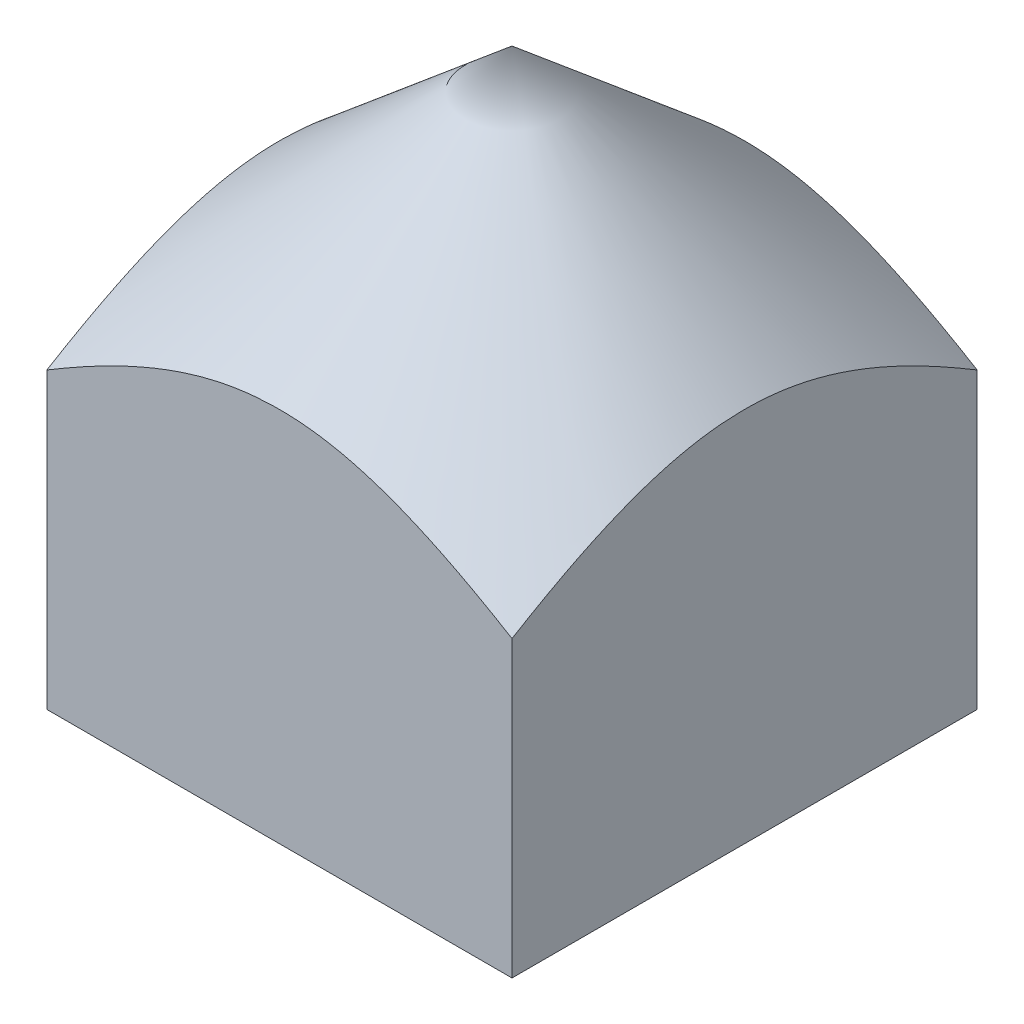
ISO-10303-21;
HEADER;
FILE_DESCRIPTION(('STEP AP214'),'2;1');
FILE_NAME('part.step','',(''),(''),'','','');
FILE_SCHEMA(('AUTOMOTIVE_DESIGN { 1 0 10303 214 1 1 1 1 }'));
ENDSEC;
DATA;
#1=APPLICATION_CONTEXT('core data for automotive mechanical design processes');
#2=APPLICATION_PROTOCOL_DEFINITION('international standard','automotive_design',2000,#1);
#3=PRODUCT_CONTEXT('',#1,'mechanical');
#4=PRODUCT('Part','Part','',(#3));
#5=PRODUCT_RELATED_PRODUCT_CATEGORY('part','',(#4));
#6=PRODUCT_DEFINITION_FORMATION('','',#4);
#7=PRODUCT_DEFINITION_CONTEXT('part definition',#1,'design');
#8=PRODUCT_DEFINITION('design','',#6,#7);
#9=PRODUCT_DEFINITION_SHAPE('','',#8);
#10=(LENGTH_UNIT() NAMED_UNIT(*) SI_UNIT(.MILLI.,.METRE.));
#11=(NAMED_UNIT(*) PLANE_ANGLE_UNIT() SI_UNIT($,.RADIAN.));
#12=(NAMED_UNIT(*) SI_UNIT($,.STERADIAN.) SOLID_ANGLE_UNIT());
#13=UNCERTAINTY_MEASURE_WITH_UNIT(LENGTH_MEASURE(1.E-05),#10,'distance_accuracy_value','');
#14=(GEOMETRIC_REPRESENTATION_CONTEXT(3) GLOBAL_UNCERTAINTY_ASSIGNED_CONTEXT((#13)) GLOBAL_UNIT_ASSIGNED_CONTEXT((#10,
#11,#12)) REPRESENTATION_CONTEXT('',''));
#15=CARTESIAN_POINT('',(0.,0.,0.));
#16=DIRECTION('',(0.,0.,1.));
#17=DIRECTION('',(1.,0.,0.));
#18=AXIS2_PLACEMENT_3D('',#15,#16,#17);
#19=CARTESIAN_POINT('',(-30.,80.,-30.));
#20=DIRECTION('',(1.,0.,0.));
#21=DIRECTION('',(0.,0.,-1.));
#22=AXIS2_PLACEMENT_3D('',#19,#20,#21);
#23=PLANE('',#22);
#24=CARTESIAN_POINT('',(-30.,-20.8765279597616,-107.229151132052));
#25=CARTESIAN_POINT('',(-30.,-19.9852520103845,-106.14425956612));
#26=CARTESIAN_POINT('',(-30.,-19.094558690057,-105.058889349194));
#27=CARTESIAN_POINT('',(-30.,-17.3144550256509,-102.887097003419));
#28=CARTESIAN_POINT('',(-30.,-16.4250446818284,-101.800674874361));
#29=CARTESIAN_POINT('',(-30.,-13.7589017954723,-98.5396729270807));
#30=CARTESIAN_POINT('',(-30.,-11.9842708707791,-96.3633739410305));
#31=CARTESIAN_POINT('',(-30.,-8.44129443081294,-92.0046442604088));
#32=CARTESIAN_POINT('',(-30.,-6.67295082706765,-89.8222120111663));
#33=CARTESIAN_POINT('',(-30.,-4.02670533960702,-86.543510670682));
#34=CARTESIAN_POINT('',(-30.,-3.14567017590401,-85.4497701594944));
#35=CARTESIAN_POINT('',(-30.,-1.38593417151468,-83.2604084693045));
#36=CARTESIAN_POINT('',(-30.,-0.507233336597738,-82.1647872856648));
#37=CARTESIAN_POINT('',(-30.,2.11746418376214,-78.8841712356425));
#38=CARTESIAN_POINT('',(-30.,3.85960060182126,-76.6960847834133));
#39=CARTESIAN_POINT('',(-30.,7.33082106888948,-72.3095824939959));
#40=CARTESIAN_POINT('',(-30.,9.05990516985917,-70.1111666979849));
#41=CARTESIAN_POINT('',(-30.,11.6407373000736,-66.8037654500193));
#42=CARTESIAN_POINT('',(-30.,12.4988333409875,-65.6997325720461));
#43=CARTESIAN_POINT('',(-30.,14.2101554330616,-63.4878955180591));
#44=CARTESIAN_POINT('',(-30.,15.0633814808091,-62.3800913394034));
#45=CARTESIAN_POINT('',(-30.,16.7642038174308,-60.1601932640217));
#46=CARTESIAN_POINT('',(-30.,17.6118001875275,-59.0480994295526));
#47=CARTESIAN_POINT('',(-30.,19.3004609948171,-56.8189662690145));
#48=CARTESIAN_POINT('',(-30.,20.1415254559069,-55.7019269610621));
#49=CARTESIAN_POINT('',(-30.,21.6866135775642,-53.6351994574951));
#50=CARTESIAN_POINT('',(-30.,22.3917283136149,-52.6863272071378));
#51=CARTESIAN_POINT('',(-30.,23.7956640031369,-50.7839347545557));
#52=CARTESIAN_POINT('',(-30.,24.4944849564577,-49.8304145522198));
#53=CARTESIAN_POINT('',(-30.,25.884895820337,-47.9179970060227));
#54=CARTESIAN_POINT('',(-30.,26.5764851533709,-46.9590992419581));
#55=CARTESIAN_POINT('',(-30.,27.9511674560688,-45.0352276178528));
#56=CARTESIAN_POINT('',(-30.,28.6342604292202,-44.0702537603063));
#57=CARTESIAN_POINT('',(-30.,29.9932527026787,-42.1293317131855));
#58=CARTESIAN_POINT('',(-30.,30.6691109192539,-41.1533547245651));
#59=CARTESIAN_POINT('',(-30.,32.0089088636578,-39.1932335038235));
#60=CARTESIAN_POINT('',(-30.,32.672848521501,-38.2090892237936));
#61=CARTESIAN_POINT('',(-30.,33.9863861560747,-36.231449044055));
#62=CARTESIAN_POINT('',(-30.,34.6359860274778,-35.2379544048235));
#63=CARTESIAN_POINT('',(-30.,35.9179911400485,-33.2399210557396));
#64=CARTESIAN_POINT('',(-30.,36.5503966244001,-32.2353825023663));
#65=CARTESIAN_POINT('',(-30.,37.6801746397263,-30.3988187117099));
#66=CARTESIAN_POINT('',(-30.,38.1810399591092,-29.5689446545425));
#67=CARTESIAN_POINT('',(-30.,39.1662161089205,-27.8993973870333));
#68=CARTESIAN_POINT('',(-30.,39.6505268637024,-27.0597241319374));
#69=CARTESIAN_POINT('',(-30.,40.5996949392769,-25.368796185026));
#70=CARTESIAN_POINT('',(-30.,41.0645410965648,-24.5175352083293));
#71=CARTESIAN_POINT('',(-30.,41.9705667583792,-22.8024753554216));
#72=CARTESIAN_POINT('',(-30.,42.4117465320165,-21.9386766219195));
#73=CARTESIAN_POINT('',(-30.,43.2637306419821,-20.2008958113478));
#74=CARTESIAN_POINT('',(-30.,43.6746605705368,-19.3269755877759));
#75=CARTESIAN_POINT('',(-30.,44.4624909565746,-17.5637608125893));
#76=CARTESIAN_POINT('',(-30.,44.8393890313293,-16.6744651896569));
#77=CARTESIAN_POINT('',(-30.,45.5517520336388,-14.8804335442692));
#78=CARTESIAN_POINT('',(-30.,45.8872608378807,-13.9757150504085));
#79=CARTESIAN_POINT('',(-30.,46.5092036180199,-12.1494616225227));
#80=CARTESIAN_POINT('',(-30.,46.7956436340059,-11.2279287737237));
#81=CARTESIAN_POINT('',(-30.,47.2033388855981,-9.75601233243632));
#82=CARTESIAN_POINT('',(-30.,47.3437070785568,-9.21088984153851));
#83=CARTESIAN_POINT('',(-30.,47.6029319081103,-8.11561496934092));
#84=CARTESIAN_POINT('',(-30.,47.7217921563313,-7.56546344884816));
#85=CARTESIAN_POINT('',(-30.,47.9363279064182,-6.4606790785766));
#86=CARTESIAN_POINT('',(-30.,48.0320049313708,-5.90604652566701));
#87=CARTESIAN_POINT('',(-30.,48.1986820876147,-4.79306362223456));
#88=CARTESIAN_POINT('',(-30.,48.2696821005465,-4.23471325389285));
#89=CARTESIAN_POINT('',(-30.,48.3855479395279,-3.11768680076491));
#90=CARTESIAN_POINT('',(-30.,48.4305232737871,-2.55902212999365));
#91=CARTESIAN_POINT('',(-30.,48.493999890865,-1.44018588964091));
#92=CARTESIAN_POINT('',(-30.,48.5125013361439,-0.880014329327778));
#93=CARTESIAN_POINT('',(-30.,48.5226888128588,0.240594380587761));
#94=CARTESIAN_POINT('',(-30.,48.514373859556,0.801031539187727));
#95=CARTESIAN_POINT('',(-30.,48.4710807881061,1.92087103366484));
#96=CARTESIAN_POINT('',(-30.,48.4361026033429,2.48027336695305));
#97=CARTESIAN_POINT('',(-30.,48.3403040776113,3.59467638878237));
#98=CARTESIAN_POINT('',(-30.,48.2795838613341,4.14968573231522));
#99=CARTESIAN_POINT('',(-30.,48.1333606474811,5.25641530058795));
#100=CARTESIAN_POINT('',(-30.,48.047857588226,5.80813551713838));
#101=CARTESIAN_POINT('',(-30.,47.8534296161305,6.90745936563585));
#102=CARTESIAN_POINT('',(-30.,47.7445028381784,7.45506266617818));
#103=CARTESIAN_POINT('',(-30.,47.5048204416943,8.54545276515691));
#104=CARTESIAN_POINT('',(-30.,47.3740647252323,9.08823954197373));
#105=CARTESIAN_POINT('',(-30.,47.0916079223155,10.1717129238979));
#106=CARTESIAN_POINT('',(-30.,46.9397886044298,10.712368590911));
#107=CARTESIAN_POINT('',(-30.,46.6175622289377,11.7880966367541));
#108=CARTESIAN_POINT('',(-30.,46.4471550066669,12.323168966077));
#109=CARTESIAN_POINT('',(-30.,46.0895297076952,13.3875092474469));
#110=CARTESIAN_POINT('',(-30.,45.90231563819,13.9167785494966));
#111=CARTESIAN_POINT('',(-30.,45.5126948635505,14.9696415823588));
#112=CARTESIAN_POINT('',(-30.,45.310288852748,15.4932355713054));
#113=CARTESIAN_POINT('',(-30.,44.6507106522047,17.1351440557246));
#114=CARTESIAN_POINT('',(-30.,44.1687229258047,18.2435357656224));
#115=CARTESIAN_POINT('',(-30.,43.1546835745841,20.437313233853));
#116=CARTESIAN_POINT('',(-30.,42.6226153226425,21.5226912038611));
#117=CARTESIAN_POINT('',(-30.,41.5182245624048,23.6743516996459));
#118=CARTESIAN_POINT('',(-30.,40.9458535059568,24.7406091851402));
#119=CARTESIAN_POINT('',(-30.,39.7695885599978,26.8553489909948));
#120=CARTESIAN_POINT('',(-30.,39.1656980433599,27.9038331974177));
#121=CARTESIAN_POINT('',(-30.,37.9298643823582,29.9902281843788));
#122=CARTESIAN_POINT('',(-30.,37.2978109769103,31.0280734245674));
#123=CARTESIAN_POINT('',(-30.,36.0129316451706,33.0908171665597));
#124=CARTESIAN_POINT('',(-30.,35.3601052796273,34.1157153939533));
#125=CARTESIAN_POINT('',(-30.,34.037864922014,36.1537997283816));
#126=CARTESIAN_POINT('',(-30.,33.3684618046468,37.1669929061363));
#127=CARTESIAN_POINT('',(-30.,32.0155989238591,39.1839212667269));
#128=CARTESIAN_POINT('',(-30.,31.3321392834976,40.1876565322507));
#129=CARTESIAN_POINT('',(-30.,29.9453677834449,42.1987604939995));
#130=CARTESIAN_POINT('',(-30.,29.2419170143494,43.20603327338));
#131=CARTESIAN_POINT('',(-30.,27.8248920645947,45.2134264955253));
#132=CARTESIAN_POINT('',(-30.,27.11131786947,46.2135469280671));
#133=CARTESIAN_POINT('',(-30.,25.6754863325193,48.207723887978));
#134=CARTESIAN_POINT('',(-30.,24.9532278909467,49.2017796227849));
#135=CARTESIAN_POINT('',(-30.,23.5013611123808,51.1845035321829));
#136=CARTESIAN_POINT('',(-30.,22.7717527822816,52.173171711826));
#137=CARTESIAN_POINT('',(-30.,21.3080417245397,54.1433250604747));
#138=CARTESIAN_POINT('',(-30.,20.5739548683271,55.1248220284642));
#139=CARTESIAN_POINT('',(-30.,19.1003113766271,57.0837034686532));
#140=CARTESIAN_POINT('',(-30.,18.3607547250196,58.0610879287195));
#141=CARTESIAN_POINT('',(-30.,16.8769031366159,60.0121809442727));
#142=CARTESIAN_POINT('',(-30.,16.1326084194326,60.9858896668482));
#143=CARTESIAN_POINT('',(-30.,14.6398257743702,62.9300883753438));
#144=CARTESIAN_POINT('',(-30.,13.8913378397475,63.9005783560836));
#145=CARTESIAN_POINT('',(-30.,11.7392244760215,66.6800515118437));
#146=CARTESIAN_POINT('',(-30.,10.3310043297188,68.4854778770695));
#147=CARTESIAN_POINT('',(-30.,7.50424597146266,72.0882507209079));
#148=CARTESIAN_POINT('',(-30.,6.08570766777886,73.8855971274575));
#149=CARTESIAN_POINT('',(-30.,3.23913530410589,77.4750075669438));
#150=CARTESIAN_POINT('',(-30.,1.81109477043582,79.2670664635025));
#151=CARTESIAN_POINT('',(-30.,-1.05191842953143,82.8456269397611));
#152=CARTESIAN_POINT('',(-30.,-2.48689107608278,84.6321285352671));
#153=CARTESIAN_POINT('',(-30.,-5.32897372560791,88.1587117856995));
#154=CARTESIAN_POINT('',(-30.,-6.73594987771562,89.8989013528407));
#155=CARTESIAN_POINT('',(-30.,-9.55457582946394,93.3754939480612));
#156=CARTESIAN_POINT('',(-30.,-10.9662256349896,95.1118969713681));
#157=CARTESIAN_POINT('',(-30.,-13.7923599879186,98.5800494115014));
#158=CARTESIAN_POINT('',(-30.,-15.2068413052122,100.311801461288));
#159=CARTESIAN_POINT('',(-30.,-18.0392401263112,103.772484509563));
#160=CARTESIAN_POINT('',(-30.,-19.4571576194069,105.501415516816));
#161=CARTESIAN_POINT('',(-30.,-20.8765279597616,107.229151132052));
#162=B_SPLINE_CURVE_WITH_KNOTS('',3,(#24,#25,#26,#27,#28,#29,#30,#31,#32,#33,#34,#35,#36,#37,
#38,#39,#40,#41,#42,#43,#44,#45,#46,#47,#48,#49,#50,#51,#52,#53,#54,#55,#56,#57,#58,#59,#60,#61,
#62,#63,#64,#65,#66,#67,#68,#69,#70,#71,#72,#73,#74,#75,#76,#77,#78,#79,#80,#81,#82,#83,#84,#85,
#86,#87,#88,#89,#90,#91,#92,#93,#94,#95,#96,#97,#98,#99,#100,#101,#102,#103,#104,#105,#106,#107,
#108,#109,#110,#111,#112,#113,#114,#115,#116,#117,#118,#119,#120,#121,#122,#123,#124,#125,#126,
#127,#128,#129,#130,#131,#132,#133,#134,#135,#136,#137,#138,#139,#140,#141,#142,#143,#144,#145,
#146,#147,#148,#149,#150,#151,#152,#153,#154,#155,#156,#157,#158,#159,#160,#161),.UNSPECIFIED.,
.F.,.F.,(4,2,2,2,2,2,2,2,2,2,2,2,2,2,2,2,2,2,2,2,2,2,2,2,2,2,2,2,2,2,2,2,2,2,2,2,2,2,2,2,2,2,2,
2,2,2,2,2,2,2,2,2,2,2,2,2,2,2,2,2,2,2,2,2,2,2,2,2,4),(0.,4.21215624368648,8.424313328212,
16.8486911523316,25.2754422419295,29.4888016696343,33.7021715011416,42.0928938457363,
50.4835827696677,54.6784445924741,58.8733093546611,63.0681134631373,67.2629022176937,
70.8094148730608,74.3559276132387,77.9027214509698,81.4495138328575,85.0108776776628,
88.572262427897,92.1331737720494,95.6940347272134,98.601799157831,101.50957687379,
104.419000058899,107.328390153906,110.224926034885,113.121664558819,116.0153053743,
118.90858974272,120.596935091957,122.284996669661,123.972947315343,125.660906056918,
127.341709462109,129.022502552805,130.703357365481,132.384216377661,134.058596749013,
135.732981287587,137.407499198284,139.082024621467,140.766361181804,142.450712664373,
144.134663614342,145.818537647915,149.442722100081,153.06811408252,156.697950439291,
160.327399163267,163.972581768464,167.617841503599,171.260770108605,174.903666834839,
178.589373339664,182.275085111588,185.961268652471,189.647448736107,193.32437927048,
197.001320645457,200.678092814547,204.354870898226,211.223867513584,218.092925270503,
224.967275020593,231.841605200934,238.55505801928,245.268519294333,251.976532464618,
258.684524754356),.UNSPECIFIED.);
#163=CARTESIAN_POINT('',(-30.,37.9182801171622,-30.));
#164=VERTEX_POINT('',#163);
#165=CARTESIAN_POINT('',(-30.,37.9182801171622,30.));
#166=VERTEX_POINT('',#165);
#167=EDGE_CURVE('E96',#164,#166,#162,.T.);
#168=ORIENTED_EDGE('',*,*,#167,.F.);
#169=DIRECTION('',(0.,-1.,0.));
#170=VECTOR('',#169,1.);
#171=CARTESIAN_POINT('',(-30.,80.,-30.));
#172=LINE('',#171,#170);
#173=CARTESIAN_POINT('',(-30.,0.,-30.));
#174=VERTEX_POINT('',#173);
#175=EDGE_CURVE('E72',#164,#174,#172,.T.);
#176=ORIENTED_EDGE('',*,*,#175,.T.);
#177=DIRECTION('',(0.,0.,1.));
#178=VECTOR('',#177,1.);
#179=CARTESIAN_POINT('',(-30.,0.,-30.));
#180=LINE('',#179,#178);
#181=CARTESIAN_POINT('',(-30.,0.,30.));
#182=VERTEX_POINT('',#181);
#183=EDGE_CURVE('E101',#174,#182,#180,.T.);
#184=ORIENTED_EDGE('',*,*,#183,.T.);
#185=DIRECTION('',(0.,-1.,0.));
#186=VECTOR('',#185,1.);
#187=CARTESIAN_POINT('',(-30.,80.,30.));
#188=LINE('',#187,#186);
#189=EDGE_CURVE('E58',#166,#182,#188,.T.);
#190=ORIENTED_EDGE('',*,*,#189,.F.);
#191=EDGE_LOOP('',(#168,#176,#184,#190));
#192=FACE_BOUND('',#191,.T.);
#193=ADVANCED_FACE('F43',(#192),#23,.F.);
#194=CARTESIAN_POINT('',(30.,80.,30.));
#195=DIRECTION('',(0.,0.,-1.));
#196=DIRECTION('',(-1.,0.,0.));
#197=AXIS2_PLACEMENT_3D('',#194,#195,#196);
#198=PLANE('',#197);
#199=CARTESIAN_POINT('',(-107.229151132052,-20.8765279597616,30.));
#200=CARTESIAN_POINT('',(-106.14425956612,-19.9852520103845,30.));
#201=CARTESIAN_POINT('',(-105.058889349194,-19.094558690057,30.));
#202=CARTESIAN_POINT('',(-102.887097003419,-17.3144550256509,30.));
#203=CARTESIAN_POINT('',(-101.80067487436,-16.4250446818284,30.));
#204=CARTESIAN_POINT('',(-98.5396729270807,-13.7589017954722,30.));
#205=CARTESIAN_POINT('',(-96.3633739410305,-11.9842708707791,30.));
#206=CARTESIAN_POINT('',(-92.0046442604088,-8.44129443081293,30.));
#207=CARTESIAN_POINT('',(-89.8222120111663,-6.67295082706765,30.));
#208=CARTESIAN_POINT('',(-86.543510670682,-4.02670533960702,30.));
#209=CARTESIAN_POINT('',(-85.4497701594944,-3.14567017590401,30.));
#210=CARTESIAN_POINT('',(-83.2604084693045,-1.38593417151468,30.));
#211=CARTESIAN_POINT('',(-82.1647872856648,-0.507233336597739,30.));
#212=CARTESIAN_POINT('',(-78.8841712356425,2.11746418376214,30.));
#213=CARTESIAN_POINT('',(-76.6960847834133,3.85960060182127,30.));
#214=CARTESIAN_POINT('',(-72.3095824939959,7.33082106888948,30.));
#215=CARTESIAN_POINT('',(-70.1111666979849,9.05990516985917,30.));
#216=CARTESIAN_POINT('',(-66.8037654500193,11.6407373000736,30.));
#217=CARTESIAN_POINT('',(-65.6997325720461,12.4988333409875,30.));
#218=CARTESIAN_POINT('',(-63.4878955180591,14.2101554330617,30.));
#219=CARTESIAN_POINT('',(-62.3800913394033,15.0633814808091,30.));
#220=CARTESIAN_POINT('',(-60.1601932640216,16.7642038174308,30.));
#221=CARTESIAN_POINT('',(-59.0480994295525,17.6118001875275,30.));
#222=CARTESIAN_POINT('',(-56.8189662690145,19.3004609948171,30.));
#223=CARTESIAN_POINT('',(-55.7019269610621,20.1415254559069,30.));
#224=CARTESIAN_POINT('',(-53.6351994574951,21.6866135775642,30.));
#225=CARTESIAN_POINT('',(-52.6863272071378,22.3917283136149,30.));
#226=CARTESIAN_POINT('',(-50.7839347545557,23.7956640031369,30.));
#227=CARTESIAN_POINT('',(-49.8304145522198,24.4944849564577,30.));
#228=CARTESIAN_POINT('',(-47.9179970060227,25.884895820337,30.));
#229=CARTESIAN_POINT('',(-46.9590992419581,26.5764851533709,30.));
#230=CARTESIAN_POINT('',(-45.0352276178528,27.9511674560688,30.));
#231=CARTESIAN_POINT('',(-44.0702537603063,28.6342604292202,30.));
#232=CARTESIAN_POINT('',(-42.1293317131855,29.9932527026787,30.));
#233=CARTESIAN_POINT('',(-41.1533547245651,30.6691109192538,30.));
#234=CARTESIAN_POINT('',(-39.1932335038235,32.0089088636577,30.));
#235=CARTESIAN_POINT('',(-38.2090892237936,32.672848521501,30.));
#236=CARTESIAN_POINT('',(-36.231449044055,33.9863861560747,30.));
#237=CARTESIAN_POINT('',(-35.2379544048235,34.6359860274778,30.));
#238=CARTESIAN_POINT('',(-33.2399210557396,35.9179911400485,30.));
#239=CARTESIAN_POINT('',(-32.2353825023663,36.5503966244001,30.));
#240=CARTESIAN_POINT('',(-30.3988187117099,37.6801746397263,30.));
#241=CARTESIAN_POINT('',(-29.5689446545425,38.1810399591092,30.));
#242=CARTESIAN_POINT('',(-27.8993973870334,39.1662161089205,30.));
#243=CARTESIAN_POINT('',(-27.0597241319374,39.6505268637024,30.));
#244=CARTESIAN_POINT('',(-25.368796185026,40.5996949392769,30.));
#245=CARTESIAN_POINT('',(-24.5175352083294,41.0645410965648,30.));
#246=CARTESIAN_POINT('',(-22.8024753554216,41.9705667583792,30.));
#247=CARTESIAN_POINT('',(-21.9386766219195,42.4117465320165,30.));
#248=CARTESIAN_POINT('',(-20.2008958113478,43.2637306419821,30.));
#249=CARTESIAN_POINT('',(-19.3269755877759,43.6746605705368,30.));
#250=CARTESIAN_POINT('',(-17.5637608125893,44.4624909565746,30.));
#251=CARTESIAN_POINT('',(-16.674465189657,44.8393890313293,30.));
#252=CARTESIAN_POINT('',(-14.8804335442692,45.5517520336388,30.));
#253=CARTESIAN_POINT('',(-13.9757150504085,45.8872608378807,30.));
#254=CARTESIAN_POINT('',(-12.1494616225228,46.5092036180199,30.));
#255=CARTESIAN_POINT('',(-11.2279287737238,46.7956436340059,30.));
#256=CARTESIAN_POINT('',(-9.75601233243632,47.2033388855981,30.));
#257=CARTESIAN_POINT('',(-9.21088984153852,47.3437070785568,30.));
#258=CARTESIAN_POINT('',(-8.11561496934092,47.6029319081103,30.));
#259=CARTESIAN_POINT('',(-7.56546344884816,47.7217921563313,30.));
#260=CARTESIAN_POINT('',(-6.46067907857659,47.9363279064182,30.));
#261=CARTESIAN_POINT('',(-5.90604652566699,48.0320049313708,30.));
#262=CARTESIAN_POINT('',(-4.79306362223454,48.1986820876147,30.));
#263=CARTESIAN_POINT('',(-4.23471325389283,48.2696821005465,30.));
#264=CARTESIAN_POINT('',(-3.1176868007649,48.3855479395279,30.));
#265=CARTESIAN_POINT('',(-2.55902212999365,48.4305232737871,30.));
#266=CARTESIAN_POINT('',(-1.44018588964093,48.493999890865,30.));
#267=CARTESIAN_POINT('',(-0.880014329327796,48.5125013361439,30.));
#268=CARTESIAN_POINT('',(0.240594380587744,48.5226888128588,30.));
#269=CARTESIAN_POINT('',(0.801031539187712,48.514373859556,30.));
#270=CARTESIAN_POINT('',(1.92087103366483,48.4710807881061,30.));
#271=CARTESIAN_POINT('',(2.48027336695304,48.4361026033429,30.));
#272=CARTESIAN_POINT('',(3.59467638878235,48.3403040776113,30.));
#273=CARTESIAN_POINT('',(4.1496857323152,48.2795838613341,30.));
#274=CARTESIAN_POINT('',(5.25641530058792,48.1333606474811,30.));
#275=CARTESIAN_POINT('',(5.80813551713835,48.047857588226,30.));
#276=CARTESIAN_POINT('',(6.90745936563582,47.8534296161305,30.));
#277=CARTESIAN_POINT('',(7.45506266617815,47.7445028381785,30.));
#278=CARTESIAN_POINT('',(8.54545276515689,47.5048204416943,30.));
#279=CARTESIAN_POINT('',(9.08823954197371,47.3740647252323,30.));
#280=CARTESIAN_POINT('',(10.1717129238979,47.0916079223155,30.));
#281=CARTESIAN_POINT('',(10.712368590911,46.9397886044298,30.));
#282=CARTESIAN_POINT('',(11.7880966367541,46.6175622289377,30.));
#283=CARTESIAN_POINT('',(12.3231689660771,46.4471550066668,30.));
#284=CARTESIAN_POINT('',(13.3875092474469,46.0895297076952,30.));
#285=CARTESIAN_POINT('',(13.9167785494966,45.90231563819,30.));
#286=CARTESIAN_POINT('',(14.9696415823588,45.5126948635505,30.));
#287=CARTESIAN_POINT('',(15.4932355713054,45.310288852748,30.));
#288=CARTESIAN_POINT('',(17.1351440557246,44.6507106522047,30.));
#289=CARTESIAN_POINT('',(18.2435357656223,44.1687229258047,30.));
#290=CARTESIAN_POINT('',(20.437313233853,43.1546835745841,30.));
#291=CARTESIAN_POINT('',(21.5226912038611,42.6226153226425,30.));
#292=CARTESIAN_POINT('',(23.6743516996459,41.5182245624048,30.));
#293=CARTESIAN_POINT('',(24.7406091851402,40.9458535059568,30.));
#294=CARTESIAN_POINT('',(26.8553489909948,39.7695885599978,30.));
#295=CARTESIAN_POINT('',(27.9038331974177,39.1656980433599,30.));
#296=CARTESIAN_POINT('',(29.9902281843788,37.9298643823582,30.));
#297=CARTESIAN_POINT('',(31.0280734245674,37.2978109769103,30.));
#298=CARTESIAN_POINT('',(33.0908171665597,36.0129316451706,30.));
#299=CARTESIAN_POINT('',(34.1157153939532,35.3601052796273,30.));
#300=CARTESIAN_POINT('',(36.1537997283816,34.037864922014,30.));
#301=CARTESIAN_POINT('',(37.1669929061363,33.3684618046468,30.));
#302=CARTESIAN_POINT('',(39.1839212667268,32.0155989238591,30.));
#303=CARTESIAN_POINT('',(40.1876565322507,31.3321392834976,30.));
#304=CARTESIAN_POINT('',(42.1987604939995,29.9453677834449,30.));
#305=CARTESIAN_POINT('',(43.2060332733799,29.2419170143494,30.));
#306=CARTESIAN_POINT('',(45.2134264955253,27.8248920645947,30.));
#307=CARTESIAN_POINT('',(46.2135469280671,27.11131786947,30.));
#308=CARTESIAN_POINT('',(48.207723887978,25.6754863325193,30.));
#309=CARTESIAN_POINT('',(49.2017796227849,24.9532278909466,30.));
#310=CARTESIAN_POINT('',(51.1845035321829,23.5013611123808,30.));
#311=CARTESIAN_POINT('',(52.173171711826,22.7717527822816,30.));
#312=CARTESIAN_POINT('',(54.1433250604746,21.3080417245397,30.));
#313=CARTESIAN_POINT('',(55.1248220284641,20.5739548683271,30.));
#314=CARTESIAN_POINT('',(57.0837034686532,19.1003113766271,30.));
#315=CARTESIAN_POINT('',(58.0610879287194,18.3607547250197,30.));
#316=CARTESIAN_POINT('',(60.0121809442727,16.8769031366159,30.));
#317=CARTESIAN_POINT('',(60.9858896668482,16.1326084194327,30.));
#318=CARTESIAN_POINT('',(62.9300883753437,14.6398257743702,30.));
#319=CARTESIAN_POINT('',(63.9005783560835,13.8913378397476,30.));
#320=CARTESIAN_POINT('',(66.6800515118436,11.7392244760215,30.));
#321=CARTESIAN_POINT('',(68.4854778770695,10.3310043297188,30.));
#322=CARTESIAN_POINT('',(72.0882507209078,7.50424597146269,30.));
#323=CARTESIAN_POINT('',(73.8855971274575,6.08570766777889,30.));
#324=CARTESIAN_POINT('',(77.4750075669438,3.2391353041059,30.));
#325=CARTESIAN_POINT('',(79.2670664635025,1.81109477043582,30.));
#326=CARTESIAN_POINT('',(82.8456269397611,-1.05191842953143,30.));
#327=CARTESIAN_POINT('',(84.6321285352671,-2.48689107608279,30.));
#328=CARTESIAN_POINT('',(88.1587117856995,-5.32897372560791,30.));
#329=CARTESIAN_POINT('',(89.8989013528407,-6.73594987771561,30.));
#330=CARTESIAN_POINT('',(93.3754939480612,-9.55457582946394,30.));
#331=CARTESIAN_POINT('',(95.1118969713681,-10.9662256349896,30.));
#332=CARTESIAN_POINT('',(98.5800494115014,-13.7923599879186,30.));
#333=CARTESIAN_POINT('',(100.311801461288,-15.2068413052121,30.));
#334=CARTESIAN_POINT('',(103.772484509563,-18.0392401263112,30.));
#335=CARTESIAN_POINT('',(105.501415516816,-19.4571576194069,30.));
#336=CARTESIAN_POINT('',(107.229151132052,-20.8765279597616,30.));
#337=B_SPLINE_CURVE_WITH_KNOTS('',3,(#199,#200,#201,#202,#203,#204,#205,#206,#207,#208,#209,
#210,#211,#212,#213,#214,#215,#216,#217,#218,#219,#220,#221,#222,#223,#224,#225,#226,#227,#228,
#229,#230,#231,#232,#233,#234,#235,#236,#237,#238,#239,#240,#241,#242,#243,#244,#245,#246,#247,
#248,#249,#250,#251,#252,#253,#254,#255,#256,#257,#258,#259,#260,#261,#262,#263,#264,#265,#266,
#267,#268,#269,#270,#271,#272,#273,#274,#275,#276,#277,#278,#279,#280,#281,#282,#283,#284,#285,
#286,#287,#288,#289,#290,#291,#292,#293,#294,#295,#296,#297,#298,#299,#300,#301,#302,#303,#304,
#305,#306,#307,#308,#309,#310,#311,#312,#313,#314,#315,#316,#317,#318,#319,#320,#321,#322,#323,
#324,#325,#326,#327,#328,#329,#330,#331,#332,#333,#334,#335,#336),.UNSPECIFIED.,.F.,.F.,(4,2,2,
2,2,2,2,2,2,2,2,2,2,2,2,2,2,2,2,2,2,2,2,2,2,2,2,2,2,2,2,2,2,2,2,2,2,2,2,2,2,2,2,2,2,2,2,2,2,2,2,
2,2,2,2,2,2,2,2,2,2,2,2,2,2,2,2,2,4),(0.,4.21215624368648,8.42431332821199,16.8486911523316,
25.2754422419295,29.4888016696343,33.7021715011415,42.0928938457363,50.4835827696677,
54.6784445924741,58.873309354661,63.0681134631373,67.2629022176937,70.8094148730608,
74.3559276132386,77.9027214509698,81.4495138328574,85.0108776776628,88.5722624278969,
92.1331737720494,95.6940347272134,98.6017991578309,101.50957687379,104.419000058899,
107.328390153906,110.224926034885,113.121664558819,116.0153053743,118.90858974272,
120.596935091957,122.284996669661,123.972947315343,125.660906056918,127.341709462109,
129.022502552805,130.703357365481,132.384216377661,134.058596749013,135.732981287587,
137.407499198284,139.082024621467,140.766361181804,142.450712664373,144.134663614342,
145.818537647915,149.442722100081,153.06811408252,156.697950439291,160.327399163267,
163.972581768464,167.617841503599,171.260770108605,174.903666834839,178.589373339664,
182.275085111588,185.961268652471,189.647448736107,193.32437927048,197.001320645457,
200.678092814547,204.354870898226,211.223867513584,218.092925270503,224.967275020593,
231.841605200934,238.55505801928,245.268519294333,251.976532464618,258.684524754356),.UNSPECIFIED.);
#338=CARTESIAN_POINT('',(30.,37.9182801171622,30.));
#339=VERTEX_POINT('',#338);
#340=EDGE_CURVE('E98',#166,#339,#337,.T.);
#341=ORIENTED_EDGE('',*,*,#340,.F.);
#342=ORIENTED_EDGE('',*,*,#189,.T.);
#343=DIRECTION('',(1.,0.,0.));
#344=VECTOR('',#343,1.);
#345=CARTESIAN_POINT('',(30.,0.,30.));
#346=LINE('',#345,#344);
#347=CARTESIAN_POINT('',(30.,0.,30.));
#348=VERTEX_POINT('',#347);
#349=EDGE_CURVE('E128',#182,#348,#346,.T.);
#350=ORIENTED_EDGE('',*,*,#349,.T.);
#351=DIRECTION('',(0.,-1.,0.));
#352=VECTOR('',#351,1.);
#353=CARTESIAN_POINT('',(30.,80.,30.));
#354=LINE('',#353,#352);
#355=EDGE_CURVE('E108',#339,#348,#354,.T.);
#356=ORIENTED_EDGE('',*,*,#355,.F.);
#357=EDGE_LOOP('',(#341,#342,#350,#356));
#358=FACE_BOUND('',#357,.T.);
#359=ADVANCED_FACE('F105',(#358),#198,.F.);
#360=CARTESIAN_POINT('',(30.,80.,-30.));
#361=DIRECTION('',(-1.,0.,0.));
#362=DIRECTION('',(0.,0.,1.));
#363=AXIS2_PLACEMENT_3D('',#360,#361,#362);
#364=PLANE('',#363);
#365=CARTESIAN_POINT('',(30.,-20.8765279597616,107.229151132052));
#366=CARTESIAN_POINT('',(30.,-19.9852520103845,106.14425956612));
#367=CARTESIAN_POINT('',(30.,-19.094558690057,105.058889349194));
#368=CARTESIAN_POINT('',(30.,-17.3144550256509,102.887097003419));
#369=CARTESIAN_POINT('',(30.,-16.4250446818284,101.800674874361));
#370=CARTESIAN_POINT('',(30.,-13.7589017954722,98.5396729270807));
#371=CARTESIAN_POINT('',(30.,-11.9842708707791,96.3633739410305));
#372=CARTESIAN_POINT('',(30.,-8.44129443081295,92.0046442604088));
#373=CARTESIAN_POINT('',(30.,-6.67295082706767,89.8222120111663));
#374=CARTESIAN_POINT('',(30.,-4.02670533960703,86.543510670682));
#375=CARTESIAN_POINT('',(30.,-3.14567017590402,85.4497701594945));
#376=CARTESIAN_POINT('',(30.,-1.38593417151469,83.2604084693045));
#377=CARTESIAN_POINT('',(30.,-0.507233336597753,82.1647872856649));
#378=CARTESIAN_POINT('',(30.,2.11746418376212,78.8841712356425));
#379=CARTESIAN_POINT('',(30.,3.85960060182124,76.6960847834134));
#380=CARTESIAN_POINT('',(30.,7.33082106888944,72.309582493996));
#381=CARTESIAN_POINT('',(30.,9.05990516985912,70.1111666979849));
#382=CARTESIAN_POINT('',(30.,11.6407373000736,66.8037654500194));
#383=CARTESIAN_POINT('',(30.,12.4988333409874,65.6997325720462));
#384=CARTESIAN_POINT('',(30.,14.2101554330616,63.4878955180592));
#385=CARTESIAN_POINT('',(30.,15.0633814808091,62.3800913394034));
#386=CARTESIAN_POINT('',(30.,16.7642038174307,60.1601932640217));
#387=CARTESIAN_POINT('',(30.,17.6118001875275,59.0480994295526));
#388=CARTESIAN_POINT('',(30.,19.300460994817,56.8189662690146));
#389=CARTESIAN_POINT('',(30.,20.1415254559068,55.7019269610622));
#390=CARTESIAN_POINT('',(30.,21.6866135775642,53.6351994574952));
#391=CARTESIAN_POINT('',(30.,22.3917283136149,52.6863272071378));
#392=CARTESIAN_POINT('',(30.,23.7956640031369,50.7839347545557));
#393=CARTESIAN_POINT('',(30.,24.4944849564577,49.8304145522199));
#394=CARTESIAN_POINT('',(30.,25.8848958203369,47.9179970060228));
#395=CARTESIAN_POINT('',(30.,26.5764851533708,46.9590992419581));
#396=CARTESIAN_POINT('',(30.,27.9511674560688,45.0352276178528));
#397=CARTESIAN_POINT('',(30.,28.6342604292202,44.0702537603064));
#398=CARTESIAN_POINT('',(30.,29.9932527026787,42.1293317131856));
#399=CARTESIAN_POINT('',(30.,30.6691109192538,41.1533547245652));
#400=CARTESIAN_POINT('',(30.,32.0089088636577,39.1932335038235));
#401=CARTESIAN_POINT('',(30.,32.672848521501,38.2090892237936));
#402=CARTESIAN_POINT('',(30.,33.9863861560747,36.231449044055));
#403=CARTESIAN_POINT('',(30.,34.6359860274778,35.2379544048235));
#404=CARTESIAN_POINT('',(30.,35.9179911400485,33.2399210557397));
#405=CARTESIAN_POINT('',(30.,36.5503966244001,32.2353825023663));
#406=CARTESIAN_POINT('',(30.,37.6801746397263,30.3988187117099));
#407=CARTESIAN_POINT('',(30.,38.1810399591092,29.5689446545425));
#408=CARTESIAN_POINT('',(30.,39.1662161089205,27.8993973870334));
#409=CARTESIAN_POINT('',(30.,39.6505268637024,27.0597241319374));
#410=CARTESIAN_POINT('',(30.,40.5996949392769,25.368796185026));
#411=CARTESIAN_POINT('',(30.,41.0645410965648,24.5175352083294));
#412=CARTESIAN_POINT('',(30.,41.9705667583792,22.8024753554217));
#413=CARTESIAN_POINT('',(30.,42.4117465320165,21.9386766219196));
#414=CARTESIAN_POINT('',(30.,43.2637306419821,20.2008958113478));
#415=CARTESIAN_POINT('',(30.,43.6746605705368,19.3269755877759));
#416=CARTESIAN_POINT('',(30.,44.4624909565746,17.5637608125893));
#417=CARTESIAN_POINT('',(30.,44.8393890313293,16.674465189657));
#418=CARTESIAN_POINT('',(30.,45.5517520336388,14.8804335442692));
#419=CARTESIAN_POINT('',(30.,45.8872608378807,13.9757150504085));
#420=CARTESIAN_POINT('',(30.,46.5092036180199,12.1494616225228));
#421=CARTESIAN_POINT('',(30.,46.7956436340059,11.2279287737238));
#422=CARTESIAN_POINT('',(30.,47.2033388855981,9.75601233243638));
#423=CARTESIAN_POINT('',(30.,47.3437070785568,9.21088984153858));
#424=CARTESIAN_POINT('',(30.,47.6029319081103,8.11561496934099));
#425=CARTESIAN_POINT('',(30.,47.7217921563313,7.56546344884823));
#426=CARTESIAN_POINT('',(30.,47.9363279064181,6.46067907857667));
#427=CARTESIAN_POINT('',(30.,48.0320049313707,5.90604652566708));
#428=CARTESIAN_POINT('',(30.,48.1986820876147,4.79306362223463));
#429=CARTESIAN_POINT('',(30.,48.2696821005465,4.23471325389291));
#430=CARTESIAN_POINT('',(30.,48.3855479395279,3.11768680076498));
#431=CARTESIAN_POINT('',(30.,48.4305232737871,2.55902212999372));
#432=CARTESIAN_POINT('',(30.,48.493999890865,1.440185889641));
#433=CARTESIAN_POINT('',(30.,48.5125013361439,0.880014329327872));
#434=CARTESIAN_POINT('',(30.,48.5226888128588,-0.240594380587654));
#435=CARTESIAN_POINT('',(30.,48.514373859556,-0.801031539187619));
#436=CARTESIAN_POINT('',(30.,48.4710807881061,-1.92087103366474));
#437=CARTESIAN_POINT('',(30.,48.4361026033429,-2.48027336695296));
#438=CARTESIAN_POINT('',(30.,48.3403040776113,-3.59467638878228));
#439=CARTESIAN_POINT('',(30.,48.2795838613341,-4.14968573231512));
#440=CARTESIAN_POINT('',(30.,48.1333606474811,-5.25641530058785));
#441=CARTESIAN_POINT('',(30.,48.047857588226,-5.80813551713828));
#442=CARTESIAN_POINT('',(30.,47.8534296161305,-6.90745936563576));
#443=CARTESIAN_POINT('',(30.,47.7445028381785,-7.45506266617809));
#444=CARTESIAN_POINT('',(30.,47.5048204416943,-8.54545276515682));
#445=CARTESIAN_POINT('',(30.,47.3740647252324,-9.08823954197365));
#446=CARTESIAN_POINT('',(30.,47.0916079223155,-10.1717129238978));
#447=CARTESIAN_POINT('',(30.,46.9397886044298,-10.7123685909109));
#448=CARTESIAN_POINT('',(30.,46.6175622289377,-11.788096636754));
#449=CARTESIAN_POINT('',(30.,46.4471550066669,-12.323168966077));
#450=CARTESIAN_POINT('',(30.,46.0895297076952,-13.3875092474468));
#451=CARTESIAN_POINT('',(30.,45.90231563819,-13.9167785494965));
#452=CARTESIAN_POINT('',(30.,45.5126948635505,-14.9696415823587));
#453=CARTESIAN_POINT('',(30.,45.310288852748,-15.4932355713053));
#454=CARTESIAN_POINT('',(30.,44.6507106522047,-17.1351440557245));
#455=CARTESIAN_POINT('',(30.,44.1687229258048,-18.2435357656222));
#456=CARTESIAN_POINT('',(30.,43.1546835745842,-20.4373132338529));
#457=CARTESIAN_POINT('',(30.,42.6226153226425,-21.522691203861));
#458=CARTESIAN_POINT('',(30.,41.5182245624049,-23.6743516996457));
#459=CARTESIAN_POINT('',(30.,40.9458535059569,-24.74060918514));
#460=CARTESIAN_POINT('',(30.,39.7695885599979,-26.8553489909946));
#461=CARTESIAN_POINT('',(30.,39.16569804336,-27.9038331974175));
#462=CARTESIAN_POINT('',(30.,37.9298643823583,-29.9902281843786));
#463=CARTESIAN_POINT('',(30.,37.2978109769105,-31.0280734245671));
#464=CARTESIAN_POINT('',(30.,36.0129316451707,-33.0908171665594));
#465=CARTESIAN_POINT('',(30.,35.3601052796274,-34.115715393953));
#466=CARTESIAN_POINT('',(30.,34.0378649220141,-36.1537997283814));
#467=CARTESIAN_POINT('',(30.,33.368461804647,-37.166992906136));
#468=CARTESIAN_POINT('',(30.,32.0155989238593,-39.1839212667265));
#469=CARTESIAN_POINT('',(30.,31.3321392834979,-40.1876565322504));
#470=CARTESIAN_POINT('',(30.,29.9453677834452,-42.1987604939992));
#471=CARTESIAN_POINT('',(30.,29.2419170143497,-43.2060332733796));
#472=CARTESIAN_POINT('',(30.,27.824892064595,-45.2134264955249));
#473=CARTESIAN_POINT('',(30.,27.1113178694703,-46.2135469280667));
#474=CARTESIAN_POINT('',(30.,25.6754863325196,-48.2077238879775));
#475=CARTESIAN_POINT('',(30.,24.953227890947,-49.2017796227845));
#476=CARTESIAN_POINT('',(30.,23.5013611123811,-51.1845035321824));
#477=CARTESIAN_POINT('',(30.,22.7717527822819,-52.1731717118255));
#478=CARTESIAN_POINT('',(30.,21.3080417245401,-54.1433250604742));
#479=CARTESIAN_POINT('',(30.,20.5739548683275,-55.1248220284636));
#480=CARTESIAN_POINT('',(30.,19.1003113766275,-57.0837034686527));
#481=CARTESIAN_POINT('',(30.,18.3607547250201,-58.0610879287189));
#482=CARTESIAN_POINT('',(30.,16.8769031366163,-60.0121809442722));
#483=CARTESIAN_POINT('',(30.,16.1326084194331,-60.9858896668476));
#484=CARTESIAN_POINT('',(30.,14.6398257743706,-62.9300883753431));
#485=CARTESIAN_POINT('',(30.,13.891337839748,-63.900578356083));
#486=CARTESIAN_POINT('',(30.,11.739224476022,-66.6800515118431));
#487=CARTESIAN_POINT('',(30.,10.3310043297192,-68.485477877069));
#488=CARTESIAN_POINT('',(30.,7.50424597146306,-72.0882507209074));
#489=CARTESIAN_POINT('',(30.,6.08570766777925,-73.885597127457));
#490=CARTESIAN_POINT('',(30.,3.23913530410623,-77.4750075669434));
#491=CARTESIAN_POINT('',(30.,1.81109477043614,-79.267066463502));
#492=CARTESIAN_POINT('',(30.,-1.05191842953115,-82.8456269397608));
#493=CARTESIAN_POINT('',(30.,-2.48689107608253,-84.6321285352668));
#494=CARTESIAN_POINT('',(30.,-5.3289737256077,-88.1587117856992));
#495=CARTESIAN_POINT('',(30.,-6.73594987771543,-89.8989013528404));
#496=CARTESIAN_POINT('',(30.,-9.55457582946378,-93.375493948061));
#497=CARTESIAN_POINT('',(30.,-10.9662256349894,-95.1118969713679));
#498=CARTESIAN_POINT('',(30.,-13.7923599879185,-98.5800494115013));
#499=CARTESIAN_POINT('',(30.,-15.2068413052121,-100.311801461288));
#500=CARTESIAN_POINT('',(30.,-18.0392401263112,-103.772484509563));
#501=CARTESIAN_POINT('',(30.,-19.4571576194069,-105.501415516816));
#502=CARTESIAN_POINT('',(30.,-20.8765279597616,-107.229151132052));
#503=B_SPLINE_CURVE_WITH_KNOTS('',3,(#365,#366,#367,#368,#369,#370,#371,#372,#373,#374,#375,
#376,#377,#378,#379,#380,#381,#382,#383,#384,#385,#386,#387,#388,#389,#390,#391,#392,#393,#394,
#395,#396,#397,#398,#399,#400,#401,#402,#403,#404,#405,#406,#407,#408,#409,#410,#411,#412,#413,
#414,#415,#416,#417,#418,#419,#420,#421,#422,#423,#424,#425,#426,#427,#428,#429,#430,#431,#432,
#433,#434,#435,#436,#437,#438,#439,#440,#441,#442,#443,#444,#445,#446,#447,#448,#449,#450,#451,
#452,#453,#454,#455,#456,#457,#458,#459,#460,#461,#462,#463,#464,#465,#466,#467,#468,#469,#470,
#471,#472,#473,#474,#475,#476,#477,#478,#479,#480,#481,#482,#483,#484,#485,#486,#487,#488,#489,
#490,#491,#492,#493,#494,#495,#496,#497,#498,#499,#500,#501,#502),.UNSPECIFIED.,.F.,.F.,(4,2,2,
2,2,2,2,2,2,2,2,2,2,2,2,2,2,2,2,2,2,2,2,2,2,2,2,2,2,2,2,2,2,2,2,2,2,2,2,2,2,2,2,2,2,2,2,2,2,2,2,
2,2,2,2,2,2,2,2,2,2,2,2,2,2,2,2,2,4),(0.,4.21215624368646,8.42431332821198,16.8486911523316,
25.2754422419294,29.4888016696343,33.7021715011415,42.0928938457363,50.4835827696676,
54.678444592474,58.873309354661,63.0681134631372,67.2629022176936,70.8094148730607,
74.3559276132386,77.9027214509698,81.4495138328574,85.0108776776628,88.5722624278969,
92.1331737720494,95.6940347272134,98.601799157831,101.50957687379,104.419000058899,
107.328390153906,110.224926034885,113.121664558819,116.0153053743,118.90858974272,
120.596935091957,122.284996669661,123.972947315343,125.660906056918,127.341709462109,
129.022502552805,130.703357365481,132.384216377661,134.058596749013,135.732981287587,
137.407499198284,139.082024621467,140.766361181803,142.450712664373,144.134663614342,
145.818537647914,149.442722100081,153.06811408252,156.697950439291,160.327399163267,
163.972581768463,167.617841503598,171.260770108605,174.903666834839,178.589373339664,
182.275085111587,185.96126865247,189.647448736106,193.324379270479,197.001320645457,
200.678092814546,204.354870898225,211.223867513583,218.092925270502,224.967275020592,
231.841605200934,238.55505801928,245.268519294333,251.976532464618,258.684524754356),.UNSPECIFIED.);
#504=CARTESIAN_POINT('',(30.,37.9182801171622,-30.));
#505=VERTEX_POINT('',#504);
#506=EDGE_CURVE('E64',#339,#505,#503,.T.);
#507=ORIENTED_EDGE('',*,*,#506,.F.);
#508=ORIENTED_EDGE('',*,*,#355,.T.);
#509=DIRECTION('',(0.,0.,-1.));
#510=VECTOR('',#509,1.);
#511=CARTESIAN_POINT('',(30.,0.,-30.));
#512=LINE('',#511,#510);
#513=CARTESIAN_POINT('',(30.,0.,-30.));
#514=VERTEX_POINT('',#513);
#515=EDGE_CURVE('E124',#348,#514,#512,.T.);
#516=ORIENTED_EDGE('',*,*,#515,.T.);
#517=DIRECTION('',(0.,-1.,0.));
#518=VECTOR('',#517,1.);
#519=CARTESIAN_POINT('',(30.,80.,-30.));
#520=LINE('',#519,#518);
#521=EDGE_CURVE('E114',#505,#514,#520,.T.);
#522=ORIENTED_EDGE('',*,*,#521,.F.);
#523=EDGE_LOOP('',(#507,#508,#516,#522));
#524=FACE_BOUND('',#523,.T.);
#525=ADVANCED_FACE('F152',(#524),#364,.F.);
#526=CARTESIAN_POINT('',(30.,80.,-30.));
#527=DIRECTION('',(0.,0.,1.));
#528=DIRECTION('',(1.,0.,0.));
#529=AXIS2_PLACEMENT_3D('',#526,#527,#528);
#530=PLANE('',#529);
#531=CARTESIAN_POINT('',(107.229151132052,-20.8765279597616,-30.));
#532=CARTESIAN_POINT('',(106.14425956612,-19.9852520103845,-30.));
#533=CARTESIAN_POINT('',(105.058889349194,-19.094558690057,-30.));
#534=CARTESIAN_POINT('',(102.887097003419,-17.3144550256509,-30.));
#535=CARTESIAN_POINT('',(101.800674874361,-16.4250446818284,-30.));
#536=CARTESIAN_POINT('',(98.5396729270807,-13.7589017954722,-30.));
#537=CARTESIAN_POINT('',(96.3633739410305,-11.9842708707791,-30.));
#538=CARTESIAN_POINT('',(92.0046442604088,-8.44129443081296,-30.));
#539=CARTESIAN_POINT('',(89.8222120111663,-6.67295082706768,-30.));
#540=CARTESIAN_POINT('',(86.543510670682,-4.02670533960703,-30.));
#541=CARTESIAN_POINT('',(85.4497701594945,-3.14567017590402,-30.));
#542=CARTESIAN_POINT('',(83.2604084693045,-1.38593417151468,-30.));
#543=CARTESIAN_POINT('',(82.1647872856649,-0.507233336597747,-30.));
#544=CARTESIAN_POINT('',(78.8841712356425,2.11746418376212,-30.));
#545=CARTESIAN_POINT('',(76.6960847834134,3.85960060182125,-30.));
#546=CARTESIAN_POINT('',(72.309582493996,7.33082106888945,-30.));
#547=CARTESIAN_POINT('',(70.1111666979849,9.05990516985913,-30.));
#548=CARTESIAN_POINT('',(66.8037654500194,11.6407373000736,-30.));
#549=CARTESIAN_POINT('',(65.6997325720461,12.4988333409875,-30.));
#550=CARTESIAN_POINT('',(63.4878955180592,14.2101554330616,-30.));
#551=CARTESIAN_POINT('',(62.3800913394034,15.0633814808091,-30.));
#552=CARTESIAN_POINT('',(60.1601932640217,16.7642038174308,-30.));
#553=CARTESIAN_POINT('',(59.0480994295526,17.6118001875275,-30.));
#554=CARTESIAN_POINT('',(56.8189662690146,19.3004609948171,-30.));
#555=CARTESIAN_POINT('',(55.7019269610622,20.1415254559069,-30.));
#556=CARTESIAN_POINT('',(53.6351994574952,21.6866135775642,-30.));
#557=CARTESIAN_POINT('',(52.6863272071378,22.3917283136149,-30.));
#558=CARTESIAN_POINT('',(50.7839347545557,23.7956640031369,-30.));
#559=CARTESIAN_POINT('',(49.8304145522198,24.4944849564577,-30.));
#560=CARTESIAN_POINT('',(47.9179970060228,25.884895820337,-30.));
#561=CARTESIAN_POINT('',(46.9590992419581,26.5764851533709,-30.));
#562=CARTESIAN_POINT('',(45.0352276178528,27.9511674560688,-30.));
#563=CARTESIAN_POINT('',(44.0702537603064,28.6342604292202,-30.));
#564=CARTESIAN_POINT('',(42.1293317131856,29.9932527026787,-30.));
#565=CARTESIAN_POINT('',(41.1533547245652,30.6691109192538,-30.));
#566=CARTESIAN_POINT('',(39.1932335038235,32.0089088636577,-30.));
#567=CARTESIAN_POINT('',(38.2090892237936,32.672848521501,-30.));
#568=CARTESIAN_POINT('',(36.231449044055,33.9863861560747,-30.));
#569=CARTESIAN_POINT('',(35.2379544048235,34.6359860274778,-30.));
#570=CARTESIAN_POINT('',(33.2399210557397,35.9179911400485,-30.));
#571=CARTESIAN_POINT('',(32.2353825023663,36.5503966244001,-30.));
#572=CARTESIAN_POINT('',(30.3988187117099,37.6801746397263,-30.));
#573=CARTESIAN_POINT('',(29.5689446545425,38.1810399591092,-30.));
#574=CARTESIAN_POINT('',(27.8993973870334,39.1662161089205,-30.));
#575=CARTESIAN_POINT('',(27.0597241319374,39.6505268637024,-30.));
#576=CARTESIAN_POINT('',(25.368796185026,40.5996949392769,-30.));
#577=CARTESIAN_POINT('',(24.5175352083294,41.0645410965648,-30.));
#578=CARTESIAN_POINT('',(22.8024753554217,41.9705667583792,-30.));
#579=CARTESIAN_POINT('',(21.9386766219196,42.4117465320165,-30.));
#580=CARTESIAN_POINT('',(20.2008958113478,43.2637306419821,-30.));
#581=CARTESIAN_POINT('',(19.3269755877759,43.6746605705368,-30.));
#582=CARTESIAN_POINT('',(17.5637608125893,44.4624909565746,-30.));
#583=CARTESIAN_POINT('',(16.674465189657,44.8393890313293,-30.));
#584=CARTESIAN_POINT('',(14.8804335442692,45.5517520336388,-30.));
#585=CARTESIAN_POINT('',(13.9757150504085,45.8872608378807,-30.));
#586=CARTESIAN_POINT('',(12.1494616225228,46.5092036180199,-30.));
#587=CARTESIAN_POINT('',(11.2279287737238,46.7956436340059,-30.));
#588=CARTESIAN_POINT('',(9.75601233243634,47.2033388855981,-30.));
#589=CARTESIAN_POINT('',(9.21088984153854,47.3437070785568,-30.));
#590=CARTESIAN_POINT('',(8.11561496934094,47.6029319081103,-30.));
#591=CARTESIAN_POINT('',(7.56546344884818,47.7217921563313,-30.));
#592=CARTESIAN_POINT('',(6.46067907857661,47.9363279064181,-30.));
#593=CARTESIAN_POINT('',(5.90604652566702,48.0320049313708,-30.));
#594=CARTESIAN_POINT('',(4.79306362223457,48.1986820876147,-30.));
#595=CARTESIAN_POINT('',(4.23471325389285,48.2696821005465,-30.));
#596=CARTESIAN_POINT('',(3.11768680076492,48.3855479395279,-30.));
#597=CARTESIAN_POINT('',(2.55902212999366,48.4305232737871,-30.));
#598=CARTESIAN_POINT('',(1.44018588964093,48.493999890865,-30.));
#599=CARTESIAN_POINT('',(0.880014329327795,48.5125013361439,-30.));
#600=CARTESIAN_POINT('',(-0.240594380587735,48.5226888128588,-30.));
#601=CARTESIAN_POINT('',(-0.801031539187694,48.514373859556,-30.));
#602=CARTESIAN_POINT('',(-1.9208710336648,48.4710807881061,-30.));
#603=CARTESIAN_POINT('',(-2.48027336695301,48.4361026033429,-30.));
#604=CARTESIAN_POINT('',(-3.59467638878234,48.3403040776113,-30.));
#605=CARTESIAN_POINT('',(-4.14968573231519,48.279583861334,-30.));
#606=CARTESIAN_POINT('',(-5.25641530058792,48.1333606474811,-30.));
#607=CARTESIAN_POINT('',(-5.80813551713835,48.047857588226,-30.));
#608=CARTESIAN_POINT('',(-6.90745936563582,47.8534296161305,-30.));
#609=CARTESIAN_POINT('',(-7.45506266617815,47.7445028381784,-30.));
#610=CARTESIAN_POINT('',(-8.54545276515688,47.5048204416943,-30.));
#611=CARTESIAN_POINT('',(-9.0882395419737,47.3740647252323,-30.));
#612=CARTESIAN_POINT('',(-10.1717129238979,47.0916079223155,-30.));
#613=CARTESIAN_POINT('',(-10.712368590911,46.9397886044298,-30.));
#614=CARTESIAN_POINT('',(-11.7880966367541,46.6175622289377,-30.));
#615=CARTESIAN_POINT('',(-12.323168966077,46.4471550066669,-30.));
#616=CARTESIAN_POINT('',(-13.3875092474468,46.0895297076952,-30.));
#617=CARTESIAN_POINT('',(-13.9167785494966,45.90231563819,-30.));
#618=CARTESIAN_POINT('',(-14.9696415823588,45.5126948635505,-30.));
#619=CARTESIAN_POINT('',(-15.4932355713053,45.310288852748,-30.));
#620=CARTESIAN_POINT('',(-17.1351440557245,44.6507106522047,-30.));
#621=CARTESIAN_POINT('',(-18.2435357656223,44.1687229258047,-30.));
#622=CARTESIAN_POINT('',(-20.437313233853,43.1546835745841,-30.));
#623=CARTESIAN_POINT('',(-21.5226912038611,42.6226153226425,-30.));
#624=CARTESIAN_POINT('',(-23.6743516996458,41.5182245624048,-30.));
#625=CARTESIAN_POINT('',(-24.7406091851402,40.9458535059568,-30.));
#626=CARTESIAN_POINT('',(-26.8553489909948,39.7695885599978,-30.));
#627=CARTESIAN_POINT('',(-27.9038331974176,39.1656980433599,-30.));
#628=CARTESIAN_POINT('',(-29.9902281843788,37.9298643823582,-30.));
#629=CARTESIAN_POINT('',(-31.0280734245673,37.2978109769104,-30.));
#630=CARTESIAN_POINT('',(-33.0908171665596,36.0129316451706,-30.));
#631=CARTESIAN_POINT('',(-34.1157153939532,35.3601052796273,-30.));
#632=CARTESIAN_POINT('',(-36.1537997283815,34.037864922014,-30.));
#633=CARTESIAN_POINT('',(-37.1669929061362,33.3684618046468,-30.));
#634=CARTESIAN_POINT('',(-39.1839212667267,32.0155989238592,-30.));
#635=CARTESIAN_POINT('',(-40.1876565322506,31.3321392834977,-30.));
#636=CARTESIAN_POINT('',(-42.1987604939994,29.945367783445,-30.));
#637=CARTESIAN_POINT('',(-43.2060332733799,29.2419170143495,-30.));
#638=CARTESIAN_POINT('',(-45.2134264955252,27.8248920645948,-30.));
#639=CARTESIAN_POINT('',(-46.213546928067,27.1113178694701,-30.));
#640=CARTESIAN_POINT('',(-48.2077238879779,25.6754863325194,-30.));
#641=CARTESIAN_POINT('',(-49.2017796227848,24.9532278909467,-30.));
#642=CARTESIAN_POINT('',(-51.1845035321828,23.5013611123809,-30.));
#643=CARTESIAN_POINT('',(-52.1731717118259,22.7717527822817,-30.));
#644=CARTESIAN_POINT('',(-54.1433250604745,21.3080417245398,-30.));
#645=CARTESIAN_POINT('',(-55.124822028464,20.5739548683272,-30.));
#646=CARTESIAN_POINT('',(-57.083703468653,19.1003113766272,-30.));
#647=CARTESIAN_POINT('',(-58.0610879287193,18.3607547250198,-30.));
#648=CARTESIAN_POINT('',(-60.0121809442726,16.876903136616,-30.));
#649=CARTESIAN_POINT('',(-60.985889666848,16.1326084194328,-30.));
#650=CARTESIAN_POINT('',(-62.9300883753435,14.6398257743703,-30.));
#651=CARTESIAN_POINT('',(-63.9005783560834,13.8913378397477,-30.));
#652=CARTESIAN_POINT('',(-66.6800515118435,11.7392244760217,-30.));
#653=CARTESIAN_POINT('',(-68.4854778770693,10.3310043297189,-30.));
#654=CARTESIAN_POINT('',(-72.0882507209077,7.50424597146281,-30.));
#655=CARTESIAN_POINT('',(-73.8855971274573,6.08570766777902,-30.));
#656=CARTESIAN_POINT('',(-77.4750075669437,3.23913530410603,-30.));
#657=CARTESIAN_POINT('',(-79.2670664635023,1.81109477043593,-30.));
#658=CARTESIAN_POINT('',(-82.845626939761,-1.05191842953133,-30.));
#659=CARTESIAN_POINT('',(-84.632128535267,-2.48689107608269,-30.));
#660=CARTESIAN_POINT('',(-88.1587117856994,-5.32897372560783,-30.));
#661=CARTESIAN_POINT('',(-89.8989013528406,-6.73594987771555,-30.));
#662=CARTESIAN_POINT('',(-93.3754939480612,-9.55457582946388,-30.));
#663=CARTESIAN_POINT('',(-95.111896971368,-10.9662256349895,-30.));
#664=CARTESIAN_POINT('',(-98.5800494115014,-13.7923599879186,-30.));
#665=CARTESIAN_POINT('',(-100.311801461288,-15.2068413052121,-30.));
#666=CARTESIAN_POINT('',(-103.772484509563,-18.0392401263112,-30.));
#667=CARTESIAN_POINT('',(-105.501415516816,-19.4571576194069,-30.));
#668=CARTESIAN_POINT('',(-107.229151132052,-20.8765279597616,-30.));
#669=B_SPLINE_CURVE_WITH_KNOTS('',3,(#531,#532,#533,#534,#535,#536,#537,#538,#539,#540,#541,
#542,#543,#544,#545,#546,#547,#548,#549,#550,#551,#552,#553,#554,#555,#556,#557,#558,#559,#560,
#561,#562,#563,#564,#565,#566,#567,#568,#569,#570,#571,#572,#573,#574,#575,#576,#577,#578,#579,
#580,#581,#582,#583,#584,#585,#586,#587,#588,#589,#590,#591,#592,#593,#594,#595,#596,#597,#598,
#599,#600,#601,#602,#603,#604,#605,#606,#607,#608,#609,#610,#611,#612,#613,#614,#615,#616,#617,
#618,#619,#620,#621,#622,#623,#624,#625,#626,#627,#628,#629,#630,#631,#632,#633,#634,#635,#636,
#637,#638,#639,#640,#641,#642,#643,#644,#645,#646,#647,#648,#649,#650,#651,#652,#653,#654,#655,
#656,#657,#658,#659,#660,#661,#662,#663,#664,#665,#666,#667,#668),.UNSPECIFIED.,.F.,.F.,(4,2,2,
2,2,2,2,2,2,2,2,2,2,2,2,2,2,2,2,2,2,2,2,2,2,2,2,2,2,2,2,2,2,2,2,2,2,2,2,2,2,2,2,2,2,2,2,2,2,2,2,
2,2,2,2,2,2,2,2,2,2,2,2,2,2,2,2,2,4),(0.,4.21215624368647,8.42431332821199,16.8486911523316,
25.2754422419295,29.4888016696343,33.7021715011415,42.0928938457363,50.4835827696677,
54.678444592474,58.873309354661,63.0681134631373,67.2629022176937,70.8094148730608,
74.3559276132386,77.9027214509698,81.4495138328574,85.0108776776628,88.5722624278969,
92.1331737720494,95.6940347272134,98.601799157831,101.50957687379,104.419000058899,
107.328390153906,110.224926034885,113.121664558819,116.0153053743,118.90858974272,
120.596935091957,122.284996669661,123.972947315343,125.660906056918,127.341709462109,
129.022502552805,130.703357365481,132.384216377661,134.058596749013,135.732981287587,
137.407499198284,139.082024621467,140.766361181803,142.450712664373,144.134663614342,
145.818537647914,149.442722100081,153.06811408252,156.697950439291,160.327399163267,
163.972581768463,167.617841503598,171.260770108605,174.903666834839,178.589373339664,
182.275085111587,185.96126865247,189.647448736106,193.32437927048,197.001320645457,
200.678092814547,204.354870898226,211.223867513584,218.092925270502,224.967275020593,
231.841605200934,238.55505801928,245.268519294333,251.976532464618,258.684524754356),.UNSPECIFIED.);
#670=EDGE_CURVE('E11',#505,#164,#669,.T.);
#671=ORIENTED_EDGE('',*,*,#670,.F.);
#672=ORIENTED_EDGE('',*,*,#521,.T.);
#673=DIRECTION('',(-1.,0.,0.));
#674=VECTOR('',#673,1.);
#675=CARTESIAN_POINT('',(30.,0.,-30.));
#676=LINE('',#675,#674);
#677=EDGE_CURVE('E121',#514,#174,#676,.T.);
#678=ORIENTED_EDGE('',*,*,#677,.T.);
#679=ORIENTED_EDGE('',*,*,#175,.F.);
#680=EDGE_LOOP('',(#671,#672,#678,#679));
#681=FACE_BOUND('',#680,.T.);
#682=ADVANCED_FACE('F155',(#681),#530,.F.);
#683=CARTESIAN_POINT('',(0.,0.,0.));
#684=DIRECTION('',(0.,-1.,0.));
#685=DIRECTION('',(0.,0.,-1.));
#686=AXIS2_PLACEMENT_3D('',#683,#684,#685);
#687=PLANE('',#686);
#688=ORIENTED_EDGE('',*,*,#183,.F.);
#689=ORIENTED_EDGE('',*,*,#677,.F.);
#690=ORIENTED_EDGE('',*,*,#515,.F.);
#691=ORIENTED_EDGE('',*,*,#349,.F.);
#692=EDGE_LOOP('',(#688,#689,#690,#691));
#693=FACE_BOUND('',#692,.T.);
#694=ADVANCED_FACE('F95',(#693),#687,.T.);
#695=CARTESIAN_POINT('',(0.,74.1115667048256,0.));
#696=DIRECTION('',(0.,-1.,0.));
#697=DIRECTION('',(0.,0.,-1.));
#698=AXIS2_PLACEMENT_3D('',#695,#696,#697);
#699=CONICAL_SURFACE('',#698,0.,0.864514595445659);
#700=CARTESIAN_POINT('',(0.,74.1115667048256,0.));
#701=VERTEX_POINT('',#700);
#702=VERTEX_LOOP('',#701);
#703=FACE_BOUND('',#702,.T.);
#704=ORIENTED_EDGE('',*,*,#167,.T.);
#705=ORIENTED_EDGE('',*,*,#340,.T.);
#706=ORIENTED_EDGE('',*,*,#506,.T.);
#707=ORIENTED_EDGE('',*,*,#670,.T.);
#708=EDGE_LOOP('',(#704,#705,#706,#707));
#709=FACE_BOUND('',#708,.T.);
#710=ADVANCED_FACE('F93',(#703,#709),#699,.T.);
#711=CLOSED_SHELL('',(#193,#359,#525,#682,#694,#710));
#712=MANIFOLD_SOLID_BREP('B2',#711);
#713=ADVANCED_BREP_SHAPE_REPRESENTATION('',(#18,#712),#14);
#714=SHAPE_DEFINITION_REPRESENTATION(#9,#713);
ENDSEC;
END-ISO-10303-21;
